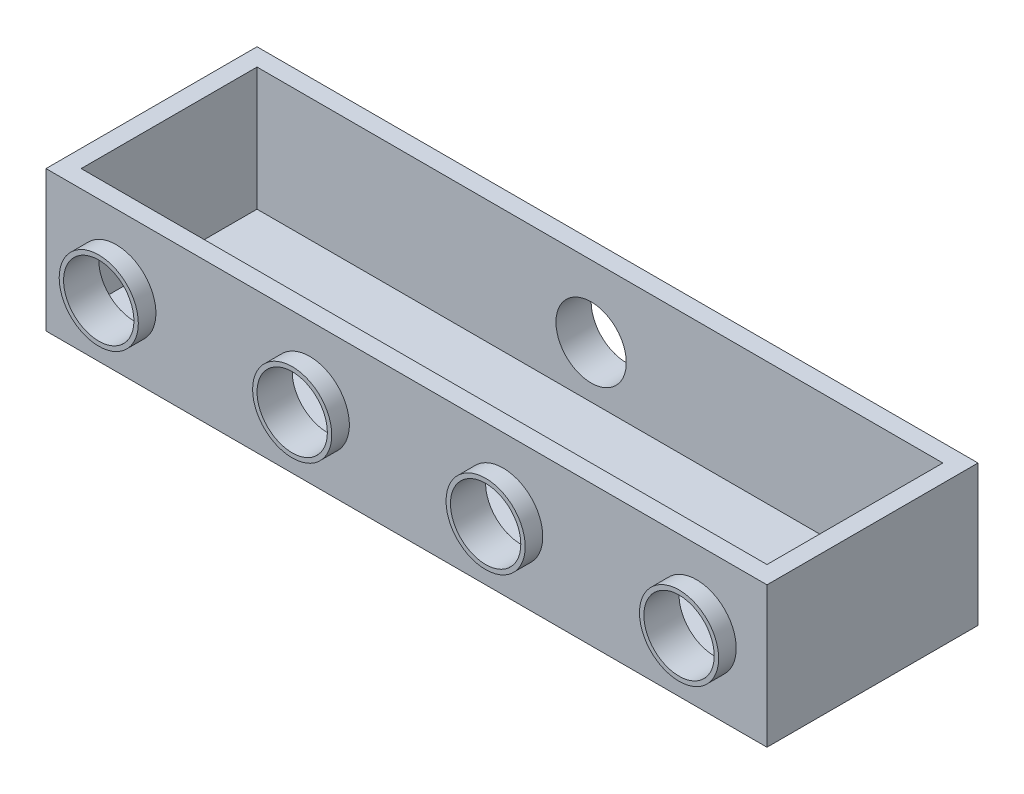
ISO-10303-21;
HEADER;
FILE_DESCRIPTION(('STEP AP214'),'2;1');
FILE_NAME('part.step','',(''),(''),'','','');
FILE_SCHEMA(('AUTOMOTIVE_DESIGN { 1 0 10303 214 1 1 1 1 }'));
ENDSEC;
DATA;
#1=APPLICATION_CONTEXT('core data for automotive mechanical design processes');
#2=APPLICATION_PROTOCOL_DEFINITION('international standard','automotive_design',2000,#1);
#3=PRODUCT_CONTEXT('',#1,'mechanical');
#4=PRODUCT('Part','Part','',(#3));
#5=PRODUCT_RELATED_PRODUCT_CATEGORY('part','',(#4));
#6=PRODUCT_DEFINITION_FORMATION('','',#4);
#7=PRODUCT_DEFINITION_CONTEXT('part definition',#1,'design');
#8=PRODUCT_DEFINITION('design','',#6,#7);
#9=PRODUCT_DEFINITION_SHAPE('','',#8);
#10=(LENGTH_UNIT() NAMED_UNIT(*) SI_UNIT(.MILLI.,.METRE.));
#11=(NAMED_UNIT(*) PLANE_ANGLE_UNIT() SI_UNIT($,.RADIAN.));
#12=(NAMED_UNIT(*) SI_UNIT($,.STERADIAN.) SOLID_ANGLE_UNIT());
#13=UNCERTAINTY_MEASURE_WITH_UNIT(LENGTH_MEASURE(1.E-05),#10,'distance_accuracy_value','');
#14=(GEOMETRIC_REPRESENTATION_CONTEXT(3) GLOBAL_UNCERTAINTY_ASSIGNED_CONTEXT((#13)) GLOBAL_UNIT_ASSIGNED_CONTEXT((#10,
#11,#12)) REPRESENTATION_CONTEXT('',''));
#15=CARTESIAN_POINT('',(0.,0.,0.));
#16=DIRECTION('',(0.,0.,1.));
#17=DIRECTION('',(1.,0.,0.));
#18=AXIS2_PLACEMENT_3D('',#15,#16,#17);
#19=CARTESIAN_POINT('',(0.,203.2,0.));
#20=DIRECTION('',(1.,0.,0.));
#21=DIRECTION('',(0.,0.,-1.));
#22=AXIS2_PLACEMENT_3D('',#19,#20,#21);
#23=PLANE('',#22);
#24=DIRECTION('',(0.,0.,1.));
#25=VECTOR('',#24,1.);
#26=CARTESIAN_POINT('',(0.,0.,0.));
#27=LINE('',#26,#25);
#28=CARTESIAN_POINT('',(0.,0.,-304.8));
#29=VERTEX_POINT('',#28);
#30=CARTESIAN_POINT('',(0.,0.,0.));
#31=VERTEX_POINT('',#30);
#32=EDGE_CURVE('E170',#29,#31,#27,.T.);
#33=ORIENTED_EDGE('',*,*,#32,.T.);
#34=DIRECTION('',(0.,-1.,0.));
#35=VECTOR('',#34,1.);
#36=CARTESIAN_POINT('',(0.,203.2,0.));
#37=LINE('',#36,#35);
#38=CARTESIAN_POINT('',(0.,203.2,0.));
#39=VERTEX_POINT('',#38);
#40=EDGE_CURVE('E191',#39,#31,#37,.T.);
#41=ORIENTED_EDGE('',*,*,#40,.F.);
#42=DIRECTION('',(0.,0.,1.));
#43=VECTOR('',#42,1.);
#44=CARTESIAN_POINT('',(0.,203.2,0.));
#45=LINE('',#44,#43);
#46=CARTESIAN_POINT('',(0.,203.2,-304.8));
#47=VERTEX_POINT('',#46);
#48=EDGE_CURVE('E171',#47,#39,#45,.T.);
#49=ORIENTED_EDGE('',*,*,#48,.F.);
#50=DIRECTION('',(0.,-1.,0.));
#51=VECTOR('',#50,1.);
#52=CARTESIAN_POINT('',(0.,203.2,-304.8));
#53=LINE('',#52,#51);
#54=EDGE_CURVE('E177',#47,#29,#53,.T.);
#55=ORIENTED_EDGE('',*,*,#54,.T.);
#56=EDGE_LOOP('',(#33,#41,#49,#55));
#57=FACE_BOUND('',#56,.T.);
#58=ADVANCED_FACE('F37',(#57),#23,.F.);
#59=CARTESIAN_POINT('',(0.,203.2,0.));
#60=DIRECTION('',(0.,0.,-1.));
#61=DIRECTION('',(-1.,0.,0.));
#62=AXIS2_PLACEMENT_3D('',#59,#60,#61);
#63=PLANE('',#62);
#64=CARTESIAN_POINT('',(939.8,101.6,0.));
#65=DIRECTION('',(0.,0.,-1.));
#66=DIRECTION('',(-1.,0.,0.));
#67=AXIS2_PLACEMENT_3D('',#64,#65,#66);
#68=CIRCLE('',#67,57.15);
#69=CARTESIAN_POINT('',(882.65,101.6,0.));
#70=VERTEX_POINT('',#69);
#71=EDGE_CURVE('E45',#70,#70,#68,.F.);
#72=ORIENTED_EDGE('',*,*,#71,.F.);
#73=EDGE_LOOP('',(#72));
#74=FACE_BOUND('',#73,.T.);
#75=CARTESIAN_POINT('',(660.4,101.6,0.));
#76=DIRECTION('',(0.,0.,-1.));
#77=DIRECTION('',(-1.,0.,0.));
#78=AXIS2_PLACEMENT_3D('',#75,#76,#77);
#79=CIRCLE('',#78,57.1499999999999);
#80=CARTESIAN_POINT('',(603.25,101.6,0.));
#81=VERTEX_POINT('',#80);
#82=EDGE_CURVE('E199',#81,#81,#79,.F.);
#83=ORIENTED_EDGE('',*,*,#82,.F.);
#84=EDGE_LOOP('',(#83));
#85=FACE_BOUND('',#84,.T.);
#86=CARTESIAN_POINT('',(381.,101.6,0.));
#87=DIRECTION('',(0.,0.,-1.));
#88=DIRECTION('',(-1.,0.,0.));
#89=AXIS2_PLACEMENT_3D('',#86,#87,#88);
#90=CIRCLE('',#89,57.1499999999999);
#91=CARTESIAN_POINT('',(323.85,101.6,0.));
#92=VERTEX_POINT('',#91);
#93=EDGE_CURVE('E196',#92,#92,#90,.F.);
#94=ORIENTED_EDGE('',*,*,#93,.F.);
#95=EDGE_LOOP('',(#94));
#96=FACE_BOUND('',#95,.T.);
#97=CARTESIAN_POINT('',(101.6,101.6,0.));
#98=DIRECTION('',(0.,0.,-1.));
#99=DIRECTION('',(-1.,0.,0.));
#100=AXIS2_PLACEMENT_3D('',#97,#98,#99);
#101=CIRCLE('',#100,57.15);
#102=CARTESIAN_POINT('',(44.4499999999999,101.6,0.));
#103=VERTEX_POINT('',#102);
#104=EDGE_CURVE('E193',#103,#103,#101,.F.);
#105=ORIENTED_EDGE('',*,*,#104,.F.);
#106=EDGE_LOOP('',(#105));
#107=FACE_BOUND('',#106,.T.);
#108=DIRECTION('',(1.,0.,0.));
#109=VECTOR('',#108,1.);
#110=CARTESIAN_POINT('',(0.,0.,0.));
#111=LINE('',#110,#109);
#112=CARTESIAN_POINT('',(1041.4,0.,0.));
#113=VERTEX_POINT('',#112);
#114=EDGE_CURVE('E180',#31,#113,#111,.T.);
#115=ORIENTED_EDGE('',*,*,#114,.T.);
#116=DIRECTION('',(0.,-1.,0.));
#117=VECTOR('',#116,1.);
#118=CARTESIAN_POINT('',(1041.4,203.2,0.));
#119=LINE('',#118,#117);
#120=CARTESIAN_POINT('',(1041.4,203.2,0.));
#121=VERTEX_POINT('',#120);
#122=EDGE_CURVE('E188',#121,#113,#119,.T.);
#123=ORIENTED_EDGE('',*,*,#122,.F.);
#124=DIRECTION('',(1.,0.,0.));
#125=VECTOR('',#124,1.);
#126=CARTESIAN_POINT('',(0.,203.2,0.));
#127=LINE('',#126,#125);
#128=EDGE_CURVE('E91',#39,#121,#127,.T.);
#129=ORIENTED_EDGE('',*,*,#128,.F.);
#130=ORIENTED_EDGE('',*,*,#40,.T.);
#131=EDGE_LOOP('',(#115,#123,#129,#130));
#132=FACE_BOUND('',#131,.T.);
#133=ADVANCED_FACE('F235',(#74,#85,#96,#107,#132),#63,.F.);
#134=CARTESIAN_POINT('',(1041.4,203.2,0.));
#135=DIRECTION('',(-1.,0.,0.));
#136=DIRECTION('',(0.,0.,1.));
#137=AXIS2_PLACEMENT_3D('',#134,#135,#136);
#138=PLANE('',#137);
#139=DIRECTION('',(0.,0.,-1.));
#140=VECTOR('',#139,1.);
#141=CARTESIAN_POINT('',(1041.4,0.,0.));
#142=LINE('',#141,#140);
#143=CARTESIAN_POINT('',(1041.4,0.,-304.8));
#144=VERTEX_POINT('',#143);
#145=EDGE_CURVE('E182',#113,#144,#142,.T.);
#146=ORIENTED_EDGE('',*,*,#145,.T.);
#147=DIRECTION('',(0.,-1.,0.));
#148=VECTOR('',#147,1.);
#149=CARTESIAN_POINT('',(1041.4,203.2,-304.8));
#150=LINE('',#149,#148);
#151=CARTESIAN_POINT('',(1041.4,203.2,-304.8));
#152=VERTEX_POINT('',#151);
#153=EDGE_CURVE('E186',#152,#144,#150,.T.);
#154=ORIENTED_EDGE('',*,*,#153,.F.);
#155=DIRECTION('',(0.,0.,-1.));
#156=VECTOR('',#155,1.);
#157=CARTESIAN_POINT('',(1041.4,203.2,0.));
#158=LINE('',#157,#156);
#159=EDGE_CURVE('E174',#121,#152,#158,.T.);
#160=ORIENTED_EDGE('',*,*,#159,.F.);
#161=ORIENTED_EDGE('',*,*,#122,.T.);
#162=EDGE_LOOP('',(#146,#154,#160,#161));
#163=FACE_BOUND('',#162,.T.);
#164=ADVANCED_FACE('F240',(#163),#138,.F.);
#165=CARTESIAN_POINT('',(0.,203.2,-304.8));
#166=DIRECTION('',(0.,0.,1.));
#167=DIRECTION('',(1.,0.,0.));
#168=AXIS2_PLACEMENT_3D('',#165,#166,#167);
#169=PLANE('',#168);
#170=CARTESIAN_POINT('',(508.,100.070914483027,-304.8));
#171=DIRECTION('',(0.,0.,1.));
#172=DIRECTION('',(1.,0.,0.));
#173=AXIS2_PLACEMENT_3D('',#170,#171,#172);
#174=CIRCLE('',#173,57.1499999999999);
#175=CARTESIAN_POINT('',(565.15,100.070914483027,-304.8));
#176=VERTEX_POINT('',#175);
#177=EDGE_CURVE('E11',#176,#176,#174,.F.);
#178=ORIENTED_EDGE('',*,*,#177,.F.);
#179=EDGE_LOOP('',(#178));
#180=FACE_BOUND('',#179,.T.);
#181=DIRECTION('',(-1.,0.,0.));
#182=VECTOR('',#181,1.);
#183=CARTESIAN_POINT('',(0.,0.,-304.8));
#184=LINE('',#183,#182);
#185=EDGE_CURVE('E83',#144,#29,#184,.T.);
#186=ORIENTED_EDGE('',*,*,#185,.T.);
#187=ORIENTED_EDGE('',*,*,#54,.F.);
#188=DIRECTION('',(-1.,0.,0.));
#189=VECTOR('',#188,1.);
#190=CARTESIAN_POINT('',(0.,203.2,-304.8));
#191=LINE('',#190,#189);
#192=EDGE_CURVE('E62',#152,#47,#191,.T.);
#193=ORIENTED_EDGE('',*,*,#192,.F.);
#194=ORIENTED_EDGE('',*,*,#153,.T.);
#195=EDGE_LOOP('',(#186,#187,#193,#194));
#196=FACE_BOUND('',#195,.T.);
#197=ADVANCED_FACE('F253',(#180,#196),#169,.F.);
#198=CARTESIAN_POINT('',(0.,203.2,0.));
#199=DIRECTION('',(0.,-1.,0.));
#200=DIRECTION('',(0.,0.,-1.));
#201=AXIS2_PLACEMENT_3D('',#198,#199,#200);
#202=PLANE('',#201);
#203=DIRECTION('',(1.,0.,0.));
#204=VECTOR('',#203,1.);
#205=CARTESIAN_POINT('',(25.4,203.2,-25.4));
#206=LINE('',#205,#204);
#207=CARTESIAN_POINT('',(25.4,203.2,-25.4));
#208=VERTEX_POINT('',#207);
#209=CARTESIAN_POINT('',(1016.,203.2,-25.4));
#210=VERTEX_POINT('',#209);
#211=EDGE_CURVE('E145',#208,#210,#206,.T.);
#212=ORIENTED_EDGE('',*,*,#211,.F.);
#213=DIRECTION('',(0.,0.,1.));
#214=VECTOR('',#213,1.);
#215=CARTESIAN_POINT('',(25.4,203.2,-25.4));
#216=LINE('',#215,#214);
#217=CARTESIAN_POINT('',(25.4,203.2,-279.4));
#218=VERTEX_POINT('',#217);
#219=EDGE_CURVE('E53',#218,#208,#216,.T.);
#220=ORIENTED_EDGE('',*,*,#219,.F.);
#221=DIRECTION('',(-1.,0.,0.));
#222=VECTOR('',#221,1.);
#223=CARTESIAN_POINT('',(25.4,203.2,-279.4));
#224=LINE('',#223,#222);
#225=CARTESIAN_POINT('',(1016.,203.2,-279.4));
#226=VERTEX_POINT('',#225);
#227=EDGE_CURVE('E133',#226,#218,#224,.T.);
#228=ORIENTED_EDGE('',*,*,#227,.F.);
#229=DIRECTION('',(0.,0.,-1.));
#230=VECTOR('',#229,1.);
#231=CARTESIAN_POINT('',(1016.,203.2,-25.4));
#232=LINE('',#231,#230);
#233=EDGE_CURVE('E136',#210,#226,#232,.T.);
#234=ORIENTED_EDGE('',*,*,#233,.F.);
#235=EDGE_LOOP('',(#212,#220,#228,#234));
#236=FACE_BOUND('',#235,.T.);
#237=ORIENTED_EDGE('',*,*,#48,.T.);
#238=ORIENTED_EDGE('',*,*,#128,.T.);
#239=ORIENTED_EDGE('',*,*,#159,.T.);
#240=ORIENTED_EDGE('',*,*,#192,.T.);
#241=EDGE_LOOP('',(#237,#238,#239,#240));
#242=FACE_BOUND('',#241,.T.);
#243=ADVANCED_FACE('F251',(#236,#242),#202,.F.);
#244=CARTESIAN_POINT('',(0.,0.,0.));
#245=DIRECTION('',(0.,-1.,0.));
#246=DIRECTION('',(0.,0.,-1.));
#247=AXIS2_PLACEMENT_3D('',#244,#245,#246);
#248=PLANE('',#247);
#249=ORIENTED_EDGE('',*,*,#32,.F.);
#250=ORIENTED_EDGE('',*,*,#185,.F.);
#251=ORIENTED_EDGE('',*,*,#145,.F.);
#252=ORIENTED_EDGE('',*,*,#114,.F.);
#253=EDGE_LOOP('',(#249,#250,#251,#252));
#254=FACE_BOUND('',#253,.T.);
#255=ADVANCED_FACE('F246',(#254),#248,.T.);
#256=CARTESIAN_POINT('',(101.6,101.6,25.4));
#257=DIRECTION('',(0.,0.,-1.));
#258=DIRECTION('',(-1.,0.,0.));
#259=AXIS2_PLACEMENT_3D('',#256,#257,#258);
#260=CYLINDRICAL_SURFACE('',#259,57.15);
#261=CARTESIAN_POINT('',(101.6,101.6,25.4));
#262=DIRECTION('',(0.,0.,1.));
#263=DIRECTION('',(1.,0.,0.));
#264=AXIS2_PLACEMENT_3D('',#261,#262,#263);
#265=CIRCLE('',#264,57.15);
#266=CARTESIAN_POINT('',(158.75,101.6,25.4));
#267=VERTEX_POINT('',#266);
#268=EDGE_CURVE('E167',#267,#267,#265,.T.);
#269=ORIENTED_EDGE('',*,*,#268,.F.);
#270=EDGE_LOOP('',(#269));
#271=FACE_BOUND('',#270,.T.);
#272=ORIENTED_EDGE('',*,*,#104,.T.);
#273=EDGE_LOOP('',(#272));
#274=FACE_BOUND('',#273,.T.);
#275=ADVANCED_FACE('F260',(#271,#274),#260,.T.);
#276=CARTESIAN_POINT('',(101.6,101.6,25.4));
#277=DIRECTION('',(0.,0.,1.));
#278=DIRECTION('',(1.,0.,0.));
#279=AXIS2_PLACEMENT_3D('',#276,#277,#278);
#280=PLANE('',#279);
#281=CARTESIAN_POINT('',(101.6,101.6,25.4));
#282=DIRECTION('',(0.,0.,1.));
#283=DIRECTION('',(1.,0.,0.));
#284=AXIS2_PLACEMENT_3D('',#281,#282,#283);
#285=CIRCLE('',#284,50.8);
#286=CARTESIAN_POINT('',(152.4,101.6,25.4));
#287=VERTEX_POINT('',#286);
#288=EDGE_CURVE('E208',#287,#287,#285,.T.);
#289=ORIENTED_EDGE('',*,*,#288,.F.);
#290=EDGE_LOOP('',(#289));
#291=FACE_BOUND('',#290,.T.);
#292=ORIENTED_EDGE('',*,*,#268,.T.);
#293=EDGE_LOOP('',(#292));
#294=FACE_BOUND('',#293,.T.);
#295=ADVANCED_FACE('F387',(#291,#294),#280,.T.);
#296=CARTESIAN_POINT('',(381.,101.6,25.4));
#297=DIRECTION('',(0.,0.,-1.));
#298=DIRECTION('',(-1.,0.,0.));
#299=AXIS2_PLACEMENT_3D('',#296,#297,#298);
#300=CYLINDRICAL_SURFACE('',#299,57.1499999999999);
#301=CARTESIAN_POINT('',(381.,101.6,25.4));
#302=DIRECTION('',(0.,0.,1.));
#303=DIRECTION('',(1.,0.,0.));
#304=AXIS2_PLACEMENT_3D('',#301,#302,#303);
#305=CIRCLE('',#304,57.1499999999999);
#306=CARTESIAN_POINT('',(438.15,101.6,25.4));
#307=VERTEX_POINT('',#306);
#308=EDGE_CURVE('E164',#307,#307,#305,.T.);
#309=ORIENTED_EDGE('',*,*,#308,.F.);
#310=EDGE_LOOP('',(#309));
#311=FACE_BOUND('',#310,.T.);
#312=ORIENTED_EDGE('',*,*,#93,.T.);
#313=EDGE_LOOP('',(#312));
#314=FACE_BOUND('',#313,.T.);
#315=ADVANCED_FACE('F395',(#311,#314),#300,.T.);
#316=CARTESIAN_POINT('',(381.,101.6,25.4));
#317=DIRECTION('',(0.,0.,1.));
#318=DIRECTION('',(1.,0.,0.));
#319=AXIS2_PLACEMENT_3D('',#316,#317,#318);
#320=PLANE('',#319);
#321=CARTESIAN_POINT('',(381.,101.6,25.4));
#322=DIRECTION('',(0.,0.,1.));
#323=DIRECTION('',(1.,0.,0.));
#324=AXIS2_PLACEMENT_3D('',#321,#322,#323);
#325=CIRCLE('',#324,50.8);
#326=CARTESIAN_POINT('',(431.8,101.6,25.4));
#327=VERTEX_POINT('',#326);
#328=EDGE_CURVE('E505',#327,#327,#325,.T.);
#329=ORIENTED_EDGE('',*,*,#328,.F.);
#330=EDGE_LOOP('',(#329));
#331=FACE_BOUND('',#330,.T.);
#332=ORIENTED_EDGE('',*,*,#308,.T.);
#333=EDGE_LOOP('',(#332));
#334=FACE_BOUND('',#333,.T.);
#335=ADVANCED_FACE('F402',(#331,#334),#320,.T.);
#336=CARTESIAN_POINT('',(660.4,101.6,25.4));
#337=DIRECTION('',(0.,0.,-1.));
#338=DIRECTION('',(-1.,0.,0.));
#339=AXIS2_PLACEMENT_3D('',#336,#337,#338);
#340=CYLINDRICAL_SURFACE('',#339,57.1499999999999);
#341=CARTESIAN_POINT('',(660.4,101.6,25.4));
#342=DIRECTION('',(0.,0.,1.));
#343=DIRECTION('',(1.,0.,0.));
#344=AXIS2_PLACEMENT_3D('',#341,#342,#343);
#345=CIRCLE('',#344,57.1499999999999);
#346=CARTESIAN_POINT('',(717.55,101.6,25.4));
#347=VERTEX_POINT('',#346);
#348=EDGE_CURVE('E161',#347,#347,#345,.T.);
#349=ORIENTED_EDGE('',*,*,#348,.F.);
#350=EDGE_LOOP('',(#349));
#351=FACE_BOUND('',#350,.T.);
#352=ORIENTED_EDGE('',*,*,#82,.T.);
#353=EDGE_LOOP('',(#352));
#354=FACE_BOUND('',#353,.T.);
#355=ADVANCED_FACE('F410',(#351,#354),#340,.T.);
#356=CARTESIAN_POINT('',(660.4,101.6,25.4));
#357=DIRECTION('',(0.,0.,1.));
#358=DIRECTION('',(1.,0.,0.));
#359=AXIS2_PLACEMENT_3D('',#356,#357,#358);
#360=PLANE('',#359);
#361=CARTESIAN_POINT('',(660.4,101.6,25.4));
#362=DIRECTION('',(0.,0.,1.));
#363=DIRECTION('',(1.,0.,0.));
#364=AXIS2_PLACEMENT_3D('',#361,#362,#363);
#365=CIRCLE('',#364,50.8);
#366=CARTESIAN_POINT('',(711.2,101.6,25.4));
#367=VERTEX_POINT('',#366);
#368=EDGE_CURVE('E503',#367,#367,#365,.T.);
#369=ORIENTED_EDGE('',*,*,#368,.F.);
#370=EDGE_LOOP('',(#369));
#371=FACE_BOUND('',#370,.T.);
#372=ORIENTED_EDGE('',*,*,#348,.T.);
#373=EDGE_LOOP('',(#372));
#374=FACE_BOUND('',#373,.T.);
#375=ADVANCED_FACE('F418',(#371,#374),#360,.T.);
#376=CARTESIAN_POINT('',(939.8,101.6,25.4));
#377=DIRECTION('',(0.,0.,-1.));
#378=DIRECTION('',(-1.,0.,0.));
#379=AXIS2_PLACEMENT_3D('',#376,#377,#378);
#380=CYLINDRICAL_SURFACE('',#379,57.15);
#381=CARTESIAN_POINT('',(939.8,101.6,25.4));
#382=DIRECTION('',(0.,0.,1.));
#383=DIRECTION('',(1.,0.,0.));
#384=AXIS2_PLACEMENT_3D('',#381,#382,#383);
#385=CIRCLE('',#384,57.15);
#386=CARTESIAN_POINT('',(996.95,101.6,25.4));
#387=VERTEX_POINT('',#386);
#388=EDGE_CURVE('E158',#387,#387,#385,.T.);
#389=ORIENTED_EDGE('',*,*,#388,.F.);
#390=EDGE_LOOP('',(#389));
#391=FACE_BOUND('',#390,.T.);
#392=ORIENTED_EDGE('',*,*,#71,.T.);
#393=EDGE_LOOP('',(#392));
#394=FACE_BOUND('',#393,.T.);
#395=ADVANCED_FACE('F425',(#391,#394),#380,.T.);
#396=CARTESIAN_POINT('',(939.8,101.6,25.4));
#397=DIRECTION('',(0.,0.,1.));
#398=DIRECTION('',(1.,0.,0.));
#399=AXIS2_PLACEMENT_3D('',#396,#397,#398);
#400=PLANE('',#399);
#401=CARTESIAN_POINT('',(939.8,101.6,25.4));
#402=DIRECTION('',(0.,0.,1.));
#403=DIRECTION('',(1.,0.,0.));
#404=AXIS2_PLACEMENT_3D('',#401,#402,#403);
#405=CIRCLE('',#404,50.8);
#406=CARTESIAN_POINT('',(990.6,101.6,25.4));
#407=VERTEX_POINT('',#406);
#408=EDGE_CURVE('E139',#407,#407,#405,.T.);
#409=ORIENTED_EDGE('',*,*,#408,.F.);
#410=EDGE_LOOP('',(#409));
#411=FACE_BOUND('',#410,.T.);
#412=ORIENTED_EDGE('',*,*,#388,.T.);
#413=EDGE_LOOP('',(#412));
#414=FACE_BOUND('',#413,.T.);
#415=ADVANCED_FACE('F432',(#411,#414),#400,.T.);
#416=CARTESIAN_POINT('',(508.,100.070914483027,-330.2));
#417=DIRECTION('',(0.,0.,1.));
#418=DIRECTION('',(1.,0.,0.));
#419=AXIS2_PLACEMENT_3D('',#416,#417,#418);
#420=CYLINDRICAL_SURFACE('',#419,57.1499999999999);
#421=CARTESIAN_POINT('',(508.,100.070914483027,-330.2));
#422=DIRECTION('',(0.,0.,-1.));
#423=DIRECTION('',(-1.,0.,0.));
#424=AXIS2_PLACEMENT_3D('',#421,#422,#423);
#425=CIRCLE('',#424,57.1499999999999);
#426=CARTESIAN_POINT('',(450.85,100.070914483027,-330.2));
#427=VERTEX_POINT('',#426);
#428=EDGE_CURVE('E152',#427,#427,#425,.T.);
#429=ORIENTED_EDGE('',*,*,#428,.F.);
#430=EDGE_LOOP('',(#429));
#431=FACE_BOUND('',#430,.T.);
#432=ORIENTED_EDGE('',*,*,#177,.T.);
#433=EDGE_LOOP('',(#432));
#434=FACE_BOUND('',#433,.T.);
#435=ADVANCED_FACE('F335',(#431,#434),#420,.T.);
#436=CARTESIAN_POINT('',(508.,100.070914483027,-330.2));
#437=DIRECTION('',(0.,0.,-1.));
#438=DIRECTION('',(-1.,0.,0.));
#439=AXIS2_PLACEMENT_3D('',#436,#437,#438);
#440=PLANE('',#439);
#441=CARTESIAN_POINT('',(508.,100.070914483027,-330.2));
#442=DIRECTION('',(0.,0.,-1.));
#443=DIRECTION('',(-1.,0.,0.));
#444=AXIS2_PLACEMENT_3D('',#441,#442,#443);
#445=CIRCLE('',#444,50.8);
#446=CARTESIAN_POINT('',(457.2,100.070914483027,-330.2));
#447=VERTEX_POINT('',#446);
#448=EDGE_CURVE('E507',#447,#447,#445,.T.);
#449=ORIENTED_EDGE('',*,*,#448,.F.);
#450=EDGE_LOOP('',(#449));
#451=FACE_BOUND('',#450,.T.);
#452=ORIENTED_EDGE('',*,*,#428,.T.);
#453=EDGE_LOOP('',(#452));
#454=FACE_BOUND('',#453,.T.);
#455=ADVANCED_FACE('F330',(#451,#454),#440,.T.);
#456=CARTESIAN_POINT('',(25.4,25.4,-25.4));
#457=DIRECTION('',(-1.,0.,0.));
#458=DIRECTION('',(0.,0.,1.));
#459=AXIS2_PLACEMENT_3D('',#456,#457,#458);
#460=PLANE('',#459);
#461=ORIENTED_EDGE('',*,*,#219,.T.);
#462=DIRECTION('',(0.,1.,0.));
#463=VECTOR('',#462,1.);
#464=CARTESIAN_POINT('',(25.4,25.4,-25.4));
#465=LINE('',#464,#463);
#466=CARTESIAN_POINT('',(25.4,25.4,-25.4));
#467=VERTEX_POINT('',#466);
#468=EDGE_CURVE('E111',#467,#208,#465,.T.);
#469=ORIENTED_EDGE('',*,*,#468,.F.);
#470=DIRECTION('',(0.,0.,1.));
#471=VECTOR('',#470,1.);
#472=CARTESIAN_POINT('',(25.4,25.4,-25.4));
#473=LINE('',#472,#471);
#474=CARTESIAN_POINT('',(25.4,25.4,-279.4));
#475=VERTEX_POINT('',#474);
#476=EDGE_CURVE('E115',#475,#467,#473,.T.);
#477=ORIENTED_EDGE('',*,*,#476,.F.);
#478=DIRECTION('',(0.,1.,0.));
#479=VECTOR('',#478,1.);
#480=CARTESIAN_POINT('',(25.4,25.4,-279.4));
#481=LINE('',#480,#479);
#482=EDGE_CURVE('E150',#475,#218,#481,.T.);
#483=ORIENTED_EDGE('',*,*,#482,.T.);
#484=EDGE_LOOP('',(#461,#469,#477,#483));
#485=FACE_BOUND('',#484,.T.);
#486=ADVANCED_FACE('F113',(#485),#460,.F.);
#487=CARTESIAN_POINT('',(25.4,25.4,-279.4));
#488=DIRECTION('',(0.,0.,-1.));
#489=DIRECTION('',(-1.,0.,0.));
#490=AXIS2_PLACEMENT_3D('',#487,#488,#489);
#491=PLANE('',#490);
#492=CARTESIAN_POINT('',(508.,100.070914483027,-279.4));
#493=DIRECTION('',(0.,0.,-1.));
#494=DIRECTION('',(-1.,0.,0.));
#495=AXIS2_PLACEMENT_3D('',#492,#493,#494);
#496=CIRCLE('',#495,50.8);
#497=CARTESIAN_POINT('',(457.2,100.070914483027,-279.4));
#498=VERTEX_POINT('',#497);
#499=EDGE_CURVE('E40',#498,#498,#496,.T.);
#500=ORIENTED_EDGE('',*,*,#499,.T.);
#501=EDGE_LOOP('',(#500));
#502=FACE_BOUND('',#501,.T.);
#503=ORIENTED_EDGE('',*,*,#227,.T.);
#504=ORIENTED_EDGE('',*,*,#482,.F.);
#505=DIRECTION('',(-1.,0.,0.));
#506=VECTOR('',#505,1.);
#507=CARTESIAN_POINT('',(25.4,25.4,-279.4));
#508=LINE('',#507,#506);
#509=CARTESIAN_POINT('',(1016.,25.4,-279.4));
#510=VERTEX_POINT('',#509);
#511=EDGE_CURVE('E121',#510,#475,#508,.T.);
#512=ORIENTED_EDGE('',*,*,#511,.F.);
#513=DIRECTION('',(0.,1.,0.));
#514=VECTOR('',#513,1.);
#515=CARTESIAN_POINT('',(1016.,25.4,-279.4));
#516=LINE('',#515,#514);
#517=EDGE_CURVE('E153',#510,#226,#516,.T.);
#518=ORIENTED_EDGE('',*,*,#517,.T.);
#519=EDGE_LOOP('',(#503,#504,#512,#518));
#520=FACE_BOUND('',#519,.T.);
#521=ADVANCED_FACE('F345',(#502,#520),#491,.F.);
#522=CARTESIAN_POINT('',(1016.,25.4,-25.4));
#523=DIRECTION('',(1.,0.,0.));
#524=DIRECTION('',(0.,0.,-1.));
#525=AXIS2_PLACEMENT_3D('',#522,#523,#524);
#526=PLANE('',#525);
#527=ORIENTED_EDGE('',*,*,#233,.T.);
#528=ORIENTED_EDGE('',*,*,#517,.F.);
#529=DIRECTION('',(0.,0.,-1.));
#530=VECTOR('',#529,1.);
#531=CARTESIAN_POINT('',(1016.,25.4,-25.4));
#532=LINE('',#531,#530);
#533=CARTESIAN_POINT('',(1016.,25.4,-25.4));
#534=VERTEX_POINT('',#533);
#535=EDGE_CURVE('E129',#534,#510,#532,.T.);
#536=ORIENTED_EDGE('',*,*,#535,.F.);
#537=DIRECTION('',(0.,1.,0.));
#538=VECTOR('',#537,1.);
#539=CARTESIAN_POINT('',(1016.,25.4,-25.4));
#540=LINE('',#539,#538);
#541=EDGE_CURVE('E120',#534,#210,#540,.T.);
#542=ORIENTED_EDGE('',*,*,#541,.T.);
#543=EDGE_LOOP('',(#527,#528,#536,#542));
#544=FACE_BOUND('',#543,.T.);
#545=ADVANCED_FACE('F286',(#544),#526,.F.);
#546=CARTESIAN_POINT('',(25.4,25.4,-25.4));
#547=DIRECTION('',(0.,0.,1.));
#548=DIRECTION('',(1.,0.,0.));
#549=AXIS2_PLACEMENT_3D('',#546,#547,#548);
#550=PLANE('',#549);
#551=CARTESIAN_POINT('',(101.6,101.6,-25.4));
#552=DIRECTION('',(0.,0.,1.));
#553=DIRECTION('',(1.,0.,0.));
#554=AXIS2_PLACEMENT_3D('',#551,#552,#553);
#555=CIRCLE('',#554,50.8);
#556=CARTESIAN_POINT('',(152.4,101.6,-25.4));
#557=VERTEX_POINT('',#556);
#558=EDGE_CURVE('E146',#557,#557,#555,.T.);
#559=ORIENTED_EDGE('',*,*,#558,.T.);
#560=EDGE_LOOP('',(#559));
#561=FACE_BOUND('',#560,.T.);
#562=CARTESIAN_POINT('',(381.,101.6,-25.4));
#563=DIRECTION('',(0.,0.,1.));
#564=DIRECTION('',(1.,0.,0.));
#565=AXIS2_PLACEMENT_3D('',#562,#563,#564);
#566=CIRCLE('',#565,50.8);
#567=CARTESIAN_POINT('',(431.8,101.6,-25.4));
#568=VERTEX_POINT('',#567);
#569=EDGE_CURVE('E211',#568,#568,#566,.T.);
#570=ORIENTED_EDGE('',*,*,#569,.T.);
#571=EDGE_LOOP('',(#570));
#572=FACE_BOUND('',#571,.T.);
#573=CARTESIAN_POINT('',(660.4,101.6,-25.4));
#574=DIRECTION('',(0.,0.,1.));
#575=DIRECTION('',(1.,0.,0.));
#576=AXIS2_PLACEMENT_3D('',#573,#574,#575);
#577=CIRCLE('',#576,50.8);
#578=CARTESIAN_POINT('',(711.2,101.6,-25.4));
#579=VERTEX_POINT('',#578);
#580=EDGE_CURVE('E207',#579,#579,#577,.T.);
#581=ORIENTED_EDGE('',*,*,#580,.T.);
#582=EDGE_LOOP('',(#581));
#583=FACE_BOUND('',#582,.T.);
#584=CARTESIAN_POINT('',(939.8,101.6,-25.4));
#585=DIRECTION('',(0.,0.,1.));
#586=DIRECTION('',(1.,0.,0.));
#587=AXIS2_PLACEMENT_3D('',#584,#585,#586);
#588=CIRCLE('',#587,50.8);
#589=CARTESIAN_POINT('',(990.6,101.6,-25.4));
#590=VERTEX_POINT('',#589);
#591=EDGE_CURVE('E204',#590,#590,#588,.T.);
#592=ORIENTED_EDGE('',*,*,#591,.T.);
#593=EDGE_LOOP('',(#592));
#594=FACE_BOUND('',#593,.T.);
#595=ORIENTED_EDGE('',*,*,#211,.T.);
#596=ORIENTED_EDGE('',*,*,#541,.F.);
#597=DIRECTION('',(1.,0.,0.));
#598=VECTOR('',#597,1.);
#599=CARTESIAN_POINT('',(25.4,25.4,-25.4));
#600=LINE('',#599,#598);
#601=EDGE_CURVE('E124',#467,#534,#600,.T.);
#602=ORIENTED_EDGE('',*,*,#601,.F.);
#603=ORIENTED_EDGE('',*,*,#468,.T.);
#604=EDGE_LOOP('',(#595,#596,#602,#603));
#605=FACE_BOUND('',#604,.T.);
#606=ADVANCED_FACE('F125',(#561,#572,#583,#594,#605),#550,.F.);
#607=CARTESIAN_POINT('',(0.,25.4,0.));
#608=DIRECTION('',(0.,-1.,0.));
#609=DIRECTION('',(0.,0.,-1.));
#610=AXIS2_PLACEMENT_3D('',#607,#608,#609);
#611=PLANE('',#610);
#612=ORIENTED_EDGE('',*,*,#476,.T.);
#613=ORIENTED_EDGE('',*,*,#601,.T.);
#614=ORIENTED_EDGE('',*,*,#535,.T.);
#615=ORIENTED_EDGE('',*,*,#511,.T.);
#616=EDGE_LOOP('',(#612,#613,#614,#615));
#617=FACE_BOUND('',#616,.T.);
#618=ADVANCED_FACE('F131',(#617),#611,.F.);
#619=CARTESIAN_POINT('',(939.8,101.6,-152.4));
#620=DIRECTION('',(0.,0.,1.));
#621=DIRECTION('',(1.,0.,0.));
#622=AXIS2_PLACEMENT_3D('',#619,#620,#621);
#623=CYLINDRICAL_SURFACE('',#622,50.8);
#624=ORIENTED_EDGE('',*,*,#408,.T.);
#625=EDGE_LOOP('',(#624));
#626=FACE_BOUND('',#625,.T.);
#627=ORIENTED_EDGE('',*,*,#591,.F.);
#628=EDGE_LOOP('',(#627));
#629=FACE_BOUND('',#628,.T.);
#630=ADVANCED_FACE('F301',(#626,#629),#623,.F.);
#631=CARTESIAN_POINT('',(660.4,101.6,-152.4));
#632=DIRECTION('',(0.,0.,1.));
#633=DIRECTION('',(1.,0.,0.));
#634=AXIS2_PLACEMENT_3D('',#631,#632,#633);
#635=CYLINDRICAL_SURFACE('',#634,50.8);
#636=ORIENTED_EDGE('',*,*,#368,.T.);
#637=EDGE_LOOP('',(#636));
#638=FACE_BOUND('',#637,.T.);
#639=ORIENTED_EDGE('',*,*,#580,.F.);
#640=EDGE_LOOP('',(#639));
#641=FACE_BOUND('',#640,.T.);
#642=ADVANCED_FACE('F230',(#638,#641),#635,.F.);
#643=CARTESIAN_POINT('',(381.,101.6,-152.4));
#644=DIRECTION('',(0.,0.,1.));
#645=DIRECTION('',(1.,0.,0.));
#646=AXIS2_PLACEMENT_3D('',#643,#644,#645);
#647=CYLINDRICAL_SURFACE('',#646,50.8);
#648=ORIENTED_EDGE('',*,*,#328,.T.);
#649=EDGE_LOOP('',(#648));
#650=FACE_BOUND('',#649,.T.);
#651=ORIENTED_EDGE('',*,*,#569,.F.);
#652=EDGE_LOOP('',(#651));
#653=FACE_BOUND('',#652,.T.);
#654=ADVANCED_FACE('F221',(#650,#653),#647,.F.);
#655=CARTESIAN_POINT('',(101.6,101.6,-152.4));
#656=DIRECTION('',(0.,0.,1.));
#657=DIRECTION('',(1.,0.,0.));
#658=AXIS2_PLACEMENT_3D('',#655,#656,#657);
#659=CYLINDRICAL_SURFACE('',#658,50.8);
#660=ORIENTED_EDGE('',*,*,#288,.T.);
#661=EDGE_LOOP('',(#660));
#662=FACE_BOUND('',#661,.T.);
#663=ORIENTED_EDGE('',*,*,#558,.F.);
#664=EDGE_LOOP('',(#663));
#665=FACE_BOUND('',#664,.T.);
#666=ADVANCED_FACE('F218',(#662,#665),#659,.F.);
#667=CARTESIAN_POINT('',(508.,100.070914483027,-152.4));
#668=DIRECTION('',(0.,0.,-1.));
#669=DIRECTION('',(-1.,0.,0.));
#670=AXIS2_PLACEMENT_3D('',#667,#668,#669);
#671=CYLINDRICAL_SURFACE('',#670,50.8);
#672=ORIENTED_EDGE('',*,*,#448,.T.);
#673=EDGE_LOOP('',(#672));
#674=FACE_BOUND('',#673,.T.);
#675=ORIENTED_EDGE('',*,*,#499,.F.);
#676=EDGE_LOOP('',(#675));
#677=FACE_BOUND('',#676,.T.);
#678=ADVANCED_FACE('F220',(#674,#677),#671,.F.);
#679=CLOSED_SHELL('',(#58,#133,#164,#197,#243,#255,#275,#295,#315,#335,#355,#375,#395,#415,#435,
#455,#486,#521,#545,#606,#618,#630,#642,#654,#666,#678));
#680=MANIFOLD_SOLID_BREP('B2',#679);
#681=ADVANCED_BREP_SHAPE_REPRESENTATION('',(#18,#680),#14);
#682=SHAPE_DEFINITION_REPRESENTATION(#9,#681);
ENDSEC;
END-ISO-10303-21;
